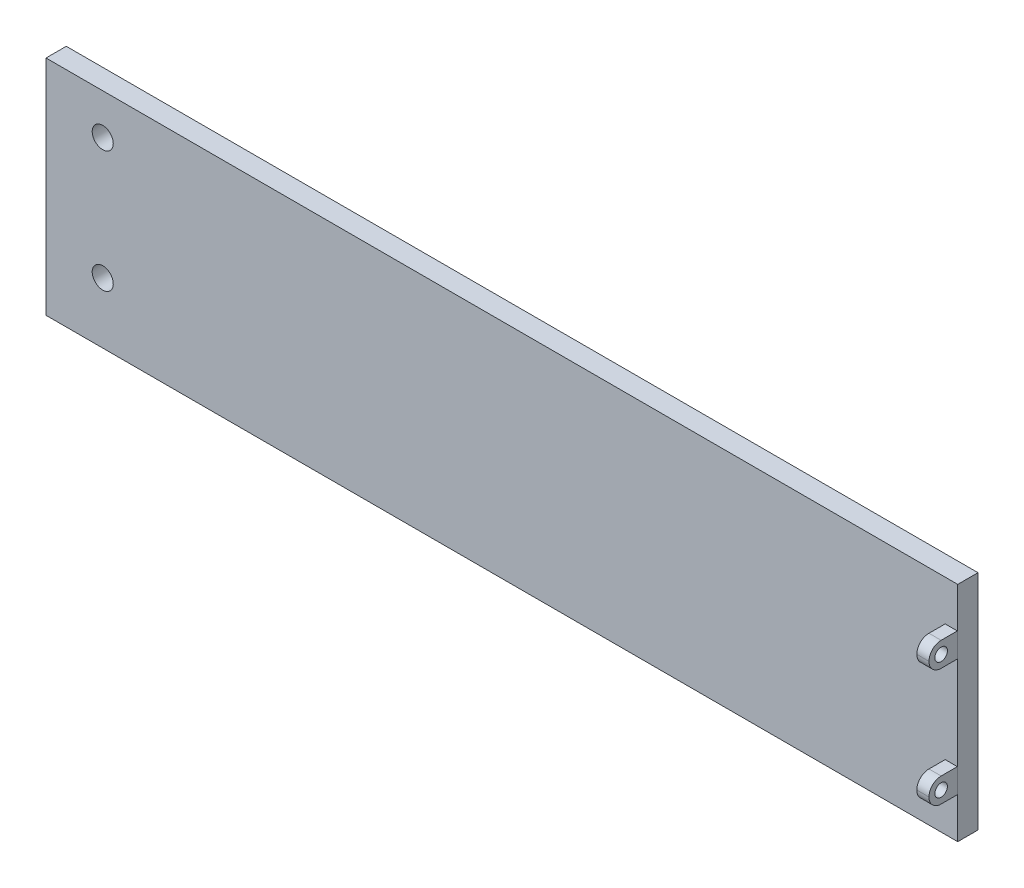
ISO-10303-21;
HEADER;
FILE_DESCRIPTION(('STEP AP214'),'2;1');
FILE_NAME('part.step','',(''),(''),'','','');
FILE_SCHEMA(('AUTOMOTIVE_DESIGN { 1 0 10303 214 1 1 1 1 }'));
ENDSEC;
DATA;
#1=APPLICATION_CONTEXT('core data for automotive mechanical design processes');
#2=APPLICATION_PROTOCOL_DEFINITION('international standard','automotive_design',2000,#1);
#3=PRODUCT_CONTEXT('',#1,'mechanical');
#4=PRODUCT('Part','Part','',(#3));
#5=PRODUCT_RELATED_PRODUCT_CATEGORY('part','',(#4));
#6=PRODUCT_DEFINITION_FORMATION('','',#4);
#7=PRODUCT_DEFINITION_CONTEXT('part definition',#1,'design');
#8=PRODUCT_DEFINITION('design','',#6,#7);
#9=PRODUCT_DEFINITION_SHAPE('','',#8);
#10=(LENGTH_UNIT() NAMED_UNIT(*) SI_UNIT(.MILLI.,.METRE.));
#11=(NAMED_UNIT(*) PLANE_ANGLE_UNIT() SI_UNIT($,.RADIAN.));
#12=(NAMED_UNIT(*) SI_UNIT($,.STERADIAN.) SOLID_ANGLE_UNIT());
#13=UNCERTAINTY_MEASURE_WITH_UNIT(LENGTH_MEASURE(1.E-05),#10,'distance_accuracy_value','');
#14=(GEOMETRIC_REPRESENTATION_CONTEXT(3) GLOBAL_UNCERTAINTY_ASSIGNED_CONTEXT((#13)) GLOBAL_UNIT_ASSIGNED_CONTEXT((#10,
#11,#12)) REPRESENTATION_CONTEXT('',''));
#15=CARTESIAN_POINT('',(0.,0.,0.));
#16=DIRECTION('',(0.,0.,1.));
#17=DIRECTION('',(1.,0.,0.));
#18=AXIS2_PLACEMENT_3D('',#15,#16,#17);
#19=CARTESIAN_POINT('',(225.,0.,0.));
#20=DIRECTION('',(-1.,0.,0.));
#21=DIRECTION('',(0.,0.,1.));
#22=AXIS2_PLACEMENT_3D('',#19,#20,#21);
#23=PLANE('',#22);
#24=DIRECTION('',(0.,0.,1.));
#25=VECTOR('',#24,1.);
#26=CARTESIAN_POINT('',(225.,0.,-4.99999999999999));
#27=LINE('',#26,#25);
#28=CARTESIAN_POINT('',(225.,0.,-4.99999999999999));
#29=VERTEX_POINT('',#28);
#30=CARTESIAN_POINT('',(225.,0.,0.));
#31=VERTEX_POINT('',#30);
#32=EDGE_CURVE('E262',#29,#31,#27,.T.);
#33=ORIENTED_EDGE('',*,*,#32,.F.);
#34=DIRECTION('',(0.,-1.,0.));
#35=VECTOR('',#34,1.);
#36=CARTESIAN_POINT('',(225.,55.,-4.99999999999998));
#37=LINE('',#36,#35);
#38=CARTESIAN_POINT('',(225.,55.,-4.99999999999998));
#39=VERTEX_POINT('',#38);
#40=EDGE_CURVE('E155',#39,#29,#37,.T.);
#41=ORIENTED_EDGE('',*,*,#40,.F.);
#42=DIRECTION('',(0.,0.,-1.));
#43=VECTOR('',#42,1.);
#44=CARTESIAN_POINT('',(225.,55.,0.));
#45=LINE('',#44,#43);
#46=CARTESIAN_POINT('',(225.,55.,0.));
#47=VERTEX_POINT('',#46);
#48=EDGE_CURVE('E152',#47,#39,#45,.T.);
#49=ORIENTED_EDGE('',*,*,#48,.F.);
#50=DIRECTION('',(0.,1.,0.));
#51=VECTOR('',#50,1.);
#52=CARTESIAN_POINT('',(225.,0.,0.));
#53=LINE('',#52,#51);
#54=EDGE_CURVE('E141',#31,#47,#53,.T.);
#55=ORIENTED_EDGE('',*,*,#54,.F.);
#56=EDGE_LOOP('',(#33,#41,#49,#55));
#57=FACE_BOUND('',#56,.T.);
#58=ADVANCED_FACE('F37',(#57),#23,.F.);
#59=CARTESIAN_POINT('',(708.,0.,0.));
#60=DIRECTION('',(0.,0.,-1.));
#61=DIRECTION('',(-1.,0.,0.));
#62=AXIS2_PLACEMENT_3D('',#59,#60,#61);
#63=PLANE('',#62);
#64=DIRECTION('',(0.,-1.,0.));
#65=VECTOR('',#64,1.);
#66=CARTESIAN_POINT('',(221.9,45.,0.));
#67=LINE('',#66,#65);
#68=CARTESIAN_POINT('',(221.9,45.,0.));
#69=VERTEX_POINT('',#68);
#70=CARTESIAN_POINT('',(221.9,39.,0.));
#71=VERTEX_POINT('',#70);
#72=EDGE_CURVE('E194',#69,#71,#67,.T.);
#73=ORIENTED_EDGE('',*,*,#72,.F.);
#74=DIRECTION('',(-1.,0.,0.));
#75=VECTOR('',#74,1.);
#76=CARTESIAN_POINT('',(221.9,45.,0.));
#77=LINE('',#76,#75);
#78=CARTESIAN_POINT('',(224.9,45.,0.));
#79=VERTEX_POINT('',#78);
#80=EDGE_CURVE('E202',#79,#69,#77,.T.);
#81=ORIENTED_EDGE('',*,*,#80,.F.);
#82=DIRECTION('',(0.,1.,0.));
#83=VECTOR('',#82,1.);
#84=CARTESIAN_POINT('',(224.9,45.,0.));
#85=LINE('',#84,#83);
#86=CARTESIAN_POINT('',(224.9,39.,0.));
#87=VERTEX_POINT('',#86);
#88=EDGE_CURVE('E199',#87,#79,#85,.T.);
#89=ORIENTED_EDGE('',*,*,#88,.F.);
#90=DIRECTION('',(1.,0.,0.));
#91=VECTOR('',#90,1.);
#92=CARTESIAN_POINT('',(221.9,39.,0.));
#93=LINE('',#92,#91);
#94=EDGE_CURVE('E196',#71,#87,#93,.T.);
#95=ORIENTED_EDGE('',*,*,#94,.F.);
#96=EDGE_LOOP('',(#73,#81,#89,#95));
#97=FACE_BOUND('',#96,.T.);
#98=CARTESIAN_POINT('',(14.,15.0000000000001,0.));
#99=DIRECTION('',(0.,0.,1.));
#100=DIRECTION('',(0.,1.,0.));
#101=AXIS2_PLACEMENT_3D('',#98,#99,#100);
#102=CIRCLE('',#101,2.60000000000007);
#103=CARTESIAN_POINT('',(14.,17.6000000000002,0.));
#104=VERTEX_POINT('',#103);
#105=EDGE_CURVE('E213',#104,#104,#102,.T.);
#106=ORIENTED_EDGE('',*,*,#105,.F.);
#107=EDGE_LOOP('',(#106));
#108=FACE_BOUND('',#107,.T.);
#109=CARTESIAN_POINT('',(14.,45.0000000000001,0.));
#110=DIRECTION('',(0.,0.,1.));
#111=DIRECTION('',(0.,1.,0.));
#112=AXIS2_PLACEMENT_3D('',#109,#110,#111);
#113=CIRCLE('',#112,2.60000000000007);
#114=CARTESIAN_POINT('',(14.,47.6000000000002,0.));
#115=VERTEX_POINT('',#114);
#116=EDGE_CURVE('E219',#115,#115,#113,.T.);
#117=ORIENTED_EDGE('',*,*,#116,.F.);
#118=EDGE_LOOP('',(#117));
#119=FACE_BOUND('',#118,.T.);
#120=DIRECTION('',(0.,-1.,0.));
#121=VECTOR('',#120,1.);
#122=CARTESIAN_POINT('',(221.9,16.,0.));
#123=LINE('',#122,#121);
#124=CARTESIAN_POINT('',(221.9,16.,0.));
#125=VERTEX_POINT('',#124);
#126=CARTESIAN_POINT('',(221.9,10.,0.));
#127=VERTEX_POINT('',#126);
#128=EDGE_CURVE('E192',#125,#127,#123,.T.);
#129=ORIENTED_EDGE('',*,*,#128,.F.);
#130=DIRECTION('',(-1.,0.,0.));
#131=VECTOR('',#130,1.);
#132=CARTESIAN_POINT('',(221.9,16.,0.));
#133=LINE('',#132,#131);
#134=CARTESIAN_POINT('',(224.9,16.,0.));
#135=VERTEX_POINT('',#134);
#136=EDGE_CURVE('E183',#135,#125,#133,.T.);
#137=ORIENTED_EDGE('',*,*,#136,.F.);
#138=DIRECTION('',(0.,1.,0.));
#139=VECTOR('',#138,1.);
#140=CARTESIAN_POINT('',(224.9,16.,0.));
#141=LINE('',#140,#139);
#142=CARTESIAN_POINT('',(224.9,10.,0.));
#143=VERTEX_POINT('',#142);
#144=EDGE_CURVE('E186',#143,#135,#141,.T.);
#145=ORIENTED_EDGE('',*,*,#144,.F.);
#146=DIRECTION('',(1.,0.,0.));
#147=VECTOR('',#146,1.);
#148=CARTESIAN_POINT('',(221.9,10.,0.));
#149=LINE('',#148,#147);
#150=EDGE_CURVE('E189',#127,#143,#149,.T.);
#151=ORIENTED_EDGE('',*,*,#150,.F.);
#152=EDGE_LOOP('',(#129,#137,#145,#151));
#153=FACE_BOUND('',#152,.T.);
#154=DIRECTION('',(-1.,0.,0.));
#155=VECTOR('',#154,1.);
#156=CARTESIAN_POINT('',(708.,0.,0.));
#157=LINE('',#156,#155);
#158=CARTESIAN_POINT('',(0.,0.,0.));
#159=VERTEX_POINT('',#158);
#160=EDGE_CURVE('E148',#31,#159,#157,.T.);
#161=ORIENTED_EDGE('',*,*,#160,.F.);
#162=ORIENTED_EDGE('',*,*,#54,.T.);
#163=DIRECTION('',(-1.,0.,0.));
#164=VECTOR('',#163,1.);
#165=CARTESIAN_POINT('',(708.,55.,0.));
#166=LINE('',#165,#164);
#167=CARTESIAN_POINT('',(0.,55.,0.));
#168=VERTEX_POINT('',#167);
#169=EDGE_CURVE('E146',#47,#168,#166,.T.);
#170=ORIENTED_EDGE('',*,*,#169,.T.);
#171=DIRECTION('',(0.,-1.,0.));
#172=VECTOR('',#171,1.);
#173=CARTESIAN_POINT('',(0.,0.,0.));
#174=LINE('',#173,#172);
#175=EDGE_CURVE('E165',#168,#159,#174,.T.);
#176=ORIENTED_EDGE('',*,*,#175,.T.);
#177=EDGE_LOOP('',(#161,#162,#170,#176));
#178=FACE_BOUND('',#177,.T.);
#179=ADVANCED_FACE('F143',(#97,#108,#119,#153,#178),#63,.F.);
#180=CARTESIAN_POINT('',(0.,55.,0.));
#181=DIRECTION('',(0.,-1.,0.));
#182=DIRECTION('',(0.,0.,-1.));
#183=AXIS2_PLACEMENT_3D('',#180,#181,#182);
#184=PLANE('',#183);
#185=ORIENTED_EDGE('',*,*,#169,.F.);
#186=ORIENTED_EDGE('',*,*,#48,.T.);
#187=DIRECTION('',(-1.,0.,0.));
#188=VECTOR('',#187,1.);
#189=CARTESIAN_POINT('',(708.,55.,-4.99999999999998));
#190=LINE('',#189,#188);
#191=CARTESIAN_POINT('',(0.,55.,-4.99999999999998));
#192=VERTEX_POINT('',#191);
#193=EDGE_CURVE('E41',#39,#192,#190,.T.);
#194=ORIENTED_EDGE('',*,*,#193,.T.);
#195=DIRECTION('',(0.,0.,1.));
#196=VECTOR('',#195,1.);
#197=CARTESIAN_POINT('',(0.,55.,0.));
#198=LINE('',#197,#196);
#199=EDGE_CURVE('E161',#192,#168,#198,.T.);
#200=ORIENTED_EDGE('',*,*,#199,.T.);
#201=EDGE_LOOP('',(#185,#186,#194,#200));
#202=FACE_BOUND('',#201,.T.);
#203=ADVANCED_FACE('F159',(#202),#184,.F.);
#204=CARTESIAN_POINT('',(708.,55.,-4.99999999999998));
#205=DIRECTION('',(0.,0.,1.));
#206=DIRECTION('',(0.,-1.,0.));
#207=AXIS2_PLACEMENT_3D('',#204,#205,#206);
#208=PLANE('',#207);
#209=CARTESIAN_POINT('',(14.,15.0000000000001,-4.99999999999999));
#210=DIRECTION('',(0.,0.,1.));
#211=DIRECTION('',(0.,1.,0.));
#212=AXIS2_PLACEMENT_3D('',#209,#210,#211);
#213=CIRCLE('',#212,2.60000000000007);
#214=CARTESIAN_POINT('',(14.,17.6000000000002,-4.99999999999999));
#215=VERTEX_POINT('',#214);
#216=EDGE_CURVE('E212',#215,#215,#213,.T.);
#217=ORIENTED_EDGE('',*,*,#216,.T.);
#218=EDGE_LOOP('',(#217));
#219=FACE_BOUND('',#218,.T.);
#220=CARTESIAN_POINT('',(14.,45.0000000000001,-4.99999999999998));
#221=DIRECTION('',(0.,0.,1.));
#222=DIRECTION('',(0.,1.,0.));
#223=AXIS2_PLACEMENT_3D('',#220,#221,#222);
#224=CIRCLE('',#223,2.60000000000007);
#225=CARTESIAN_POINT('',(14.,47.6000000000002,-4.99999999999998));
#226=VERTEX_POINT('',#225);
#227=EDGE_CURVE('E216',#226,#226,#224,.T.);
#228=ORIENTED_EDGE('',*,*,#227,.T.);
#229=EDGE_LOOP('',(#228));
#230=FACE_BOUND('',#229,.T.);
#231=ORIENTED_EDGE('',*,*,#193,.F.);
#232=ORIENTED_EDGE('',*,*,#40,.T.);
#233=DIRECTION('',(-1.,0.,0.));
#234=VECTOR('',#233,1.);
#235=CARTESIAN_POINT('',(708.,0.,-4.99999999999999));
#236=LINE('',#235,#234);
#237=CARTESIAN_POINT('',(0.,0.,-4.99999999999999));
#238=VERTEX_POINT('',#237);
#239=EDGE_CURVE('E163',#29,#238,#236,.T.);
#240=ORIENTED_EDGE('',*,*,#239,.T.);
#241=DIRECTION('',(0.,1.,0.));
#242=VECTOR('',#241,1.);
#243=CARTESIAN_POINT('',(0.,55.,-4.99999999999998));
#244=LINE('',#243,#242);
#245=EDGE_CURVE('E227',#238,#192,#244,.T.);
#246=ORIENTED_EDGE('',*,*,#245,.T.);
#247=EDGE_LOOP('',(#231,#232,#240,#246));
#248=FACE_BOUND('',#247,.T.);
#249=ADVANCED_FACE('F267',(#219,#230,#248),#208,.F.);
#250=CARTESIAN_POINT('',(708.,0.,-4.99999999999999));
#251=DIRECTION('',(0.,1.,0.));
#252=DIRECTION('',(0.,0.,1.));
#253=AXIS2_PLACEMENT_3D('',#250,#251,#252);
#254=PLANE('',#253);
#255=ORIENTED_EDGE('',*,*,#239,.F.);
#256=ORIENTED_EDGE('',*,*,#32,.T.);
#257=ORIENTED_EDGE('',*,*,#160,.T.);
#258=DIRECTION('',(0.,0.,-1.));
#259=VECTOR('',#258,1.);
#260=CARTESIAN_POINT('',(0.,0.,-4.99999999999999));
#261=LINE('',#260,#259);
#262=EDGE_CURVE('E222',#159,#238,#261,.T.);
#263=ORIENTED_EDGE('',*,*,#262,.T.);
#264=EDGE_LOOP('',(#255,#256,#257,#263));
#265=FACE_BOUND('',#264,.T.);
#266=ADVANCED_FACE('F39',(#265),#254,.F.);
#267=CARTESIAN_POINT('',(0.,0.,0.));
#268=DIRECTION('',(-1.,0.,0.));
#269=DIRECTION('',(0.,0.,1.));
#270=AXIS2_PLACEMENT_3D('',#267,#268,#269);
#271=PLANE('',#270);
#272=ORIENTED_EDGE('',*,*,#199,.F.);
#273=ORIENTED_EDGE('',*,*,#245,.F.);
#274=ORIENTED_EDGE('',*,*,#262,.F.);
#275=ORIENTED_EDGE('',*,*,#175,.F.);
#276=EDGE_LOOP('',(#272,#273,#274,#275));
#277=FACE_BOUND('',#276,.T.);
#278=ADVANCED_FACE('F273',(#277),#271,.T.);
#279=CARTESIAN_POINT('',(14.,45.0000000000001,0.));
#280=DIRECTION('',(0.,0.,-1.));
#281=DIRECTION('',(0.,1.,0.));
#282=AXIS2_PLACEMENT_3D('',#279,#280,#281);
#283=CYLINDRICAL_SURFACE('',#282,2.60000000000007);
#284=ORIENTED_EDGE('',*,*,#116,.T.);
#285=EDGE_LOOP('',(#284));
#286=FACE_BOUND('',#285,.T.);
#287=ORIENTED_EDGE('',*,*,#227,.F.);
#288=EDGE_LOOP('',(#287));
#289=FACE_BOUND('',#288,.T.);
#290=ADVANCED_FACE('F275',(#286,#289),#283,.F.);
#291=CARTESIAN_POINT('',(14.,15.0000000000001,0.));
#292=DIRECTION('',(0.,0.,-1.));
#293=DIRECTION('',(0.,1.,0.));
#294=AXIS2_PLACEMENT_3D('',#291,#292,#293);
#295=CYLINDRICAL_SURFACE('',#294,2.60000000000007);
#296=ORIENTED_EDGE('',*,*,#105,.T.);
#297=EDGE_LOOP('',(#296));
#298=FACE_BOUND('',#297,.T.);
#299=ORIENTED_EDGE('',*,*,#216,.F.);
#300=EDGE_LOOP('',(#299));
#301=FACE_BOUND('',#300,.T.);
#302=ADVANCED_FACE('F282',(#298,#301),#295,.F.);
#303=CARTESIAN_POINT('',(221.9,45.,7.));
#304=DIRECTION('',(1.,0.,0.));
#305=DIRECTION('',(0.,0.,-1.));
#306=AXIS2_PLACEMENT_3D('',#303,#304,#305);
#307=PLANE('',#306);
#308=CARTESIAN_POINT('',(221.9,42.,4.));
#309=DIRECTION('',(-1.,0.,0.));
#310=DIRECTION('',(0.,0.,1.));
#311=AXIS2_PLACEMENT_3D('',#308,#309,#310);
#312=CIRCLE('',#311,1.55);
#313=CARTESIAN_POINT('',(221.9,42.,5.55));
#314=VERTEX_POINT('',#313);
#315=EDGE_CURVE('E168',#314,#314,#312,.T.);
#316=ORIENTED_EDGE('',*,*,#315,.F.);
#317=EDGE_LOOP('',(#316));
#318=FACE_BOUND('',#317,.T.);
#319=DIRECTION('',(0.,0.,-1.));
#320=VECTOR('',#319,1.);
#321=CARTESIAN_POINT('',(221.9,39.,7.));
#322=LINE('',#321,#320);
#323=CARTESIAN_POINT('',(221.9,39.,4.));
#324=VERTEX_POINT('',#323);
#325=EDGE_CURVE('E210',#324,#71,#322,.T.);
#326=ORIENTED_EDGE('',*,*,#325,.F.);
#327=CARTESIAN_POINT('',(221.9,42.,4.));
#328=DIRECTION('',(1.,0.,0.));
#329=DIRECTION('',(0.,0.,-1.));
#330=AXIS2_PLACEMENT_3D('',#327,#328,#329);
#331=CIRCLE('',#330,3.);
#332=CARTESIAN_POINT('',(221.9,42.,7.));
#333=VERTEX_POINT('',#332);
#334=EDGE_CURVE('E258',#324,#333,#331,.F.);
#335=ORIENTED_EDGE('',*,*,#334,.T.);
#336=CARTESIAN_POINT('',(221.9,42.,4.));
#337=DIRECTION('',(1.,0.,0.));
#338=DIRECTION('',(0.,0.,-1.));
#339=AXIS2_PLACEMENT_3D('',#336,#337,#338);
#340=CIRCLE('',#339,3.);
#341=CARTESIAN_POINT('',(221.9,45.,4.));
#342=VERTEX_POINT('',#341);
#343=EDGE_CURVE('E256',#333,#342,#340,.F.);
#344=ORIENTED_EDGE('',*,*,#343,.T.);
#345=DIRECTION('',(0.,0.,-1.));
#346=VECTOR('',#345,1.);
#347=CARTESIAN_POINT('',(221.9,45.,7.));
#348=LINE('',#347,#346);
#349=EDGE_CURVE('E62',#342,#69,#348,.T.);
#350=ORIENTED_EDGE('',*,*,#349,.T.);
#351=ORIENTED_EDGE('',*,*,#72,.T.);
#352=EDGE_LOOP('',(#326,#335,#344,#350,#351));
#353=FACE_BOUND('',#352,.T.);
#354=ADVANCED_FACE('F367',(#318,#353),#307,.F.);
#355=CARTESIAN_POINT('',(221.9,39.,7.));
#356=DIRECTION('',(0.,1.,0.));
#357=DIRECTION('',(0.,0.,1.));
#358=AXIS2_PLACEMENT_3D('',#355,#356,#357);
#359=PLANE('',#358);
#360=DIRECTION('',(0.,0.,-1.));
#361=VECTOR('',#360,1.);
#362=CARTESIAN_POINT('',(224.9,39.,7.));
#363=LINE('',#362,#361);
#364=CARTESIAN_POINT('',(224.9,39.,4.));
#365=VERTEX_POINT('',#364);
#366=EDGE_CURVE('E208',#365,#87,#363,.T.);
#367=ORIENTED_EDGE('',*,*,#366,.F.);
#368=DIRECTION('',(1.,0.,0.));
#369=VECTOR('',#368,1.);
#370=CARTESIAN_POINT('',(221.9,39.,4.));
#371=LINE('',#370,#369);
#372=EDGE_CURVE('E253',#365,#324,#371,.F.);
#373=ORIENTED_EDGE('',*,*,#372,.T.);
#374=ORIENTED_EDGE('',*,*,#325,.T.);
#375=ORIENTED_EDGE('',*,*,#94,.T.);
#376=EDGE_LOOP('',(#367,#373,#374,#375));
#377=FACE_BOUND('',#376,.T.);
#378=ADVANCED_FACE('F373',(#377),#359,.F.);
#379=CARTESIAN_POINT('',(224.9,45.,7.));
#380=DIRECTION('',(-1.,0.,0.));
#381=DIRECTION('',(0.,0.,1.));
#382=AXIS2_PLACEMENT_3D('',#379,#380,#381);
#383=PLANE('',#382);
#384=CARTESIAN_POINT('',(224.9,42.,4.));
#385=DIRECTION('',(-1.,0.,0.));
#386=DIRECTION('',(0.,0.,1.));
#387=AXIS2_PLACEMENT_3D('',#384,#385,#386);
#388=CIRCLE('',#387,1.55);
#389=CARTESIAN_POINT('',(224.9,42.,5.55));
#390=VERTEX_POINT('',#389);
#391=EDGE_CURVE('E177',#390,#390,#388,.T.);
#392=ORIENTED_EDGE('',*,*,#391,.T.);
#393=EDGE_LOOP('',(#392));
#394=FACE_BOUND('',#393,.T.);
#395=CARTESIAN_POINT('',(224.9,42.,4.));
#396=DIRECTION('',(-1.,0.,0.));
#397=DIRECTION('',(0.,0.,1.));
#398=AXIS2_PLACEMENT_3D('',#395,#396,#397);
#399=CIRCLE('',#398,3.);
#400=CARTESIAN_POINT('',(224.9,45.,4.));
#401=VERTEX_POINT('',#400);
#402=CARTESIAN_POINT('',(224.9,42.,7.));
#403=VERTEX_POINT('',#402);
#404=EDGE_CURVE('E249',#401,#403,#399,.F.);
#405=ORIENTED_EDGE('',*,*,#404,.T.);
#406=CARTESIAN_POINT('',(224.9,42.,4.));
#407=DIRECTION('',(-1.,0.,0.));
#408=DIRECTION('',(0.,0.,1.));
#409=AXIS2_PLACEMENT_3D('',#406,#407,#408);
#410=CIRCLE('',#409,3.);
#411=EDGE_CURVE('E251',#403,#365,#410,.F.);
#412=ORIENTED_EDGE('',*,*,#411,.T.);
#413=ORIENTED_EDGE('',*,*,#366,.T.);
#414=ORIENTED_EDGE('',*,*,#88,.T.);
#415=DIRECTION('',(0.,0.,-1.));
#416=VECTOR('',#415,1.);
#417=CARTESIAN_POINT('',(224.9,45.,7.));
#418=LINE('',#417,#416);
#419=EDGE_CURVE('E206',#401,#79,#418,.T.);
#420=ORIENTED_EDGE('',*,*,#419,.F.);
#421=EDGE_LOOP('',(#405,#412,#413,#414,#420));
#422=FACE_BOUND('',#421,.T.);
#423=ADVANCED_FACE('F379',(#394,#422),#383,.F.);
#424=CARTESIAN_POINT('',(221.9,45.,7.));
#425=DIRECTION('',(0.,-1.,0.));
#426=DIRECTION('',(0.,0.,-1.));
#427=AXIS2_PLACEMENT_3D('',#424,#425,#426);
#428=PLANE('',#427);
#429=ORIENTED_EDGE('',*,*,#349,.F.);
#430=DIRECTION('',(-1.,0.,0.));
#431=VECTOR('',#430,1.);
#432=CARTESIAN_POINT('',(224.9,45.,4.));
#433=LINE('',#432,#431);
#434=EDGE_CURVE('E260',#342,#401,#433,.F.);
#435=ORIENTED_EDGE('',*,*,#434,.T.);
#436=ORIENTED_EDGE('',*,*,#419,.T.);
#437=ORIENTED_EDGE('',*,*,#80,.T.);
#438=EDGE_LOOP('',(#429,#435,#436,#437));
#439=FACE_BOUND('',#438,.T.);
#440=ADVANCED_FACE('F349',(#439),#428,.F.);
#441=CARTESIAN_POINT('',(221.9,16.,7.));
#442=DIRECTION('',(1.,0.,0.));
#443=DIRECTION('',(0.,0.,-1.));
#444=AXIS2_PLACEMENT_3D('',#441,#442,#443);
#445=PLANE('',#444);
#446=CARTESIAN_POINT('',(221.9,13.,4.));
#447=DIRECTION('',(-1.,0.,0.));
#448=DIRECTION('',(0.,0.,1.));
#449=AXIS2_PLACEMENT_3D('',#446,#447,#448);
#450=CIRCLE('',#449,1.55);
#451=CARTESIAN_POINT('',(221.9,13.,5.55));
#452=VERTEX_POINT('',#451);
#453=EDGE_CURVE('E171',#452,#452,#450,.T.);
#454=ORIENTED_EDGE('',*,*,#453,.F.);
#455=EDGE_LOOP('',(#454));
#456=FACE_BOUND('',#455,.T.);
#457=DIRECTION('',(0.,0.,-1.));
#458=VECTOR('',#457,1.);
#459=CARTESIAN_POINT('',(221.9,10.,7.));
#460=LINE('',#459,#458);
#461=CARTESIAN_POINT('',(221.9,10.,4.));
#462=VERTEX_POINT('',#461);
#463=EDGE_CURVE('E175',#462,#127,#460,.T.);
#464=ORIENTED_EDGE('',*,*,#463,.F.);
#465=CARTESIAN_POINT('',(221.9,13.,4.));
#466=DIRECTION('',(1.,0.,0.));
#467=DIRECTION('',(0.,0.,-1.));
#468=AXIS2_PLACEMENT_3D('',#465,#466,#467);
#469=CIRCLE('',#468,3.);
#470=CARTESIAN_POINT('',(221.9,13.,7.));
#471=VERTEX_POINT('',#470);
#472=EDGE_CURVE('E245',#462,#471,#469,.F.);
#473=ORIENTED_EDGE('',*,*,#472,.T.);
#474=CARTESIAN_POINT('',(221.9,13.,4.));
#475=DIRECTION('',(1.,0.,0.));
#476=DIRECTION('',(0.,0.,-1.));
#477=AXIS2_PLACEMENT_3D('',#474,#475,#476);
#478=CIRCLE('',#477,3.);
#479=CARTESIAN_POINT('',(221.9,16.,4.));
#480=VERTEX_POINT('',#479);
#481=EDGE_CURVE('E243',#471,#480,#478,.F.);
#482=ORIENTED_EDGE('',*,*,#481,.T.);
#483=DIRECTION('',(0.,0.,-1.));
#484=VECTOR('',#483,1.);
#485=CARTESIAN_POINT('',(221.9,16.,7.));
#486=LINE('',#485,#484);
#487=EDGE_CURVE('E54',#480,#125,#486,.T.);
#488=ORIENTED_EDGE('',*,*,#487,.T.);
#489=ORIENTED_EDGE('',*,*,#128,.T.);
#490=EDGE_LOOP('',(#464,#473,#482,#488,#489));
#491=FACE_BOUND('',#490,.T.);
#492=ADVANCED_FACE('F324',(#456,#491),#445,.F.);
#493=CARTESIAN_POINT('',(221.9,10.,7.));
#494=DIRECTION('',(0.,1.,0.));
#495=DIRECTION('',(0.,0.,1.));
#496=AXIS2_PLACEMENT_3D('',#493,#494,#495);
#497=PLANE('',#496);
#498=DIRECTION('',(0.,0.,-1.));
#499=VECTOR('',#498,1.);
#500=CARTESIAN_POINT('',(224.9,10.,7.));
#501=LINE('',#500,#499);
#502=CARTESIAN_POINT('',(224.9,10.,4.));
#503=VERTEX_POINT('',#502);
#504=EDGE_CURVE('E178',#503,#143,#501,.T.);
#505=ORIENTED_EDGE('',*,*,#504,.F.);
#506=DIRECTION('',(1.,0.,0.));
#507=VECTOR('',#506,1.);
#508=CARTESIAN_POINT('',(221.9,10.,4.));
#509=LINE('',#508,#507);
#510=EDGE_CURVE('E240',#503,#462,#509,.F.);
#511=ORIENTED_EDGE('',*,*,#510,.T.);
#512=ORIENTED_EDGE('',*,*,#463,.T.);
#513=ORIENTED_EDGE('',*,*,#150,.T.);
#514=EDGE_LOOP('',(#505,#511,#512,#513));
#515=FACE_BOUND('',#514,.T.);
#516=ADVANCED_FACE('F322',(#515),#497,.F.);
#517=CARTESIAN_POINT('',(224.9,16.,7.));
#518=DIRECTION('',(-1.,0.,0.));
#519=DIRECTION('',(0.,0.,1.));
#520=AXIS2_PLACEMENT_3D('',#517,#518,#519);
#521=PLANE('',#520);
#522=CARTESIAN_POINT('',(224.9,13.,4.));
#523=DIRECTION('',(-1.,0.,0.));
#524=DIRECTION('',(0.,0.,1.));
#525=AXIS2_PLACEMENT_3D('',#522,#523,#524);
#526=CIRCLE('',#525,1.55);
#527=CARTESIAN_POINT('',(224.9,13.,5.55));
#528=VERTEX_POINT('',#527);
#529=EDGE_CURVE('E172',#528,#528,#526,.T.);
#530=ORIENTED_EDGE('',*,*,#529,.T.);
#531=EDGE_LOOP('',(#530));
#532=FACE_BOUND('',#531,.T.);
#533=CARTESIAN_POINT('',(224.9,13.,4.));
#534=DIRECTION('',(-1.,0.,0.));
#535=DIRECTION('',(0.,0.,1.));
#536=AXIS2_PLACEMENT_3D('',#533,#534,#535);
#537=CIRCLE('',#536,3.);
#538=CARTESIAN_POINT('',(224.9,16.,4.));
#539=VERTEX_POINT('',#538);
#540=CARTESIAN_POINT('',(224.9,13.,7.));
#541=VERTEX_POINT('',#540);
#542=EDGE_CURVE('E236',#539,#541,#537,.F.);
#543=ORIENTED_EDGE('',*,*,#542,.T.);
#544=CARTESIAN_POINT('',(224.9,13.,4.));
#545=DIRECTION('',(-1.,0.,0.));
#546=DIRECTION('',(0.,0.,1.));
#547=AXIS2_PLACEMENT_3D('',#544,#545,#546);
#548=CIRCLE('',#547,3.);
#549=EDGE_CURVE('E238',#541,#503,#548,.F.);
#550=ORIENTED_EDGE('',*,*,#549,.T.);
#551=ORIENTED_EDGE('',*,*,#504,.T.);
#552=ORIENTED_EDGE('',*,*,#144,.T.);
#553=DIRECTION('',(0.,0.,-1.));
#554=VECTOR('',#553,1.);
#555=CARTESIAN_POINT('',(224.9,16.,7.));
#556=LINE('',#555,#554);
#557=EDGE_CURVE('E180',#539,#135,#556,.T.);
#558=ORIENTED_EDGE('',*,*,#557,.F.);
#559=EDGE_LOOP('',(#543,#550,#551,#552,#558));
#560=FACE_BOUND('',#559,.T.);
#561=ADVANCED_FACE('F334',(#532,#560),#521,.F.);
#562=CARTESIAN_POINT('',(221.9,16.,7.));
#563=DIRECTION('',(0.,-1.,0.));
#564=DIRECTION('',(0.,0.,-1.));
#565=AXIS2_PLACEMENT_3D('',#562,#563,#564);
#566=PLANE('',#565);
#567=ORIENTED_EDGE('',*,*,#487,.F.);
#568=DIRECTION('',(-1.,0.,0.));
#569=VECTOR('',#568,1.);
#570=CARTESIAN_POINT('',(224.9,16.,4.));
#571=LINE('',#570,#569);
#572=EDGE_CURVE('E247',#480,#539,#571,.F.);
#573=ORIENTED_EDGE('',*,*,#572,.T.);
#574=ORIENTED_EDGE('',*,*,#557,.T.);
#575=ORIENTED_EDGE('',*,*,#136,.T.);
#576=EDGE_LOOP('',(#567,#573,#574,#575));
#577=FACE_BOUND('',#576,.T.);
#578=ADVANCED_FACE('F329',(#577),#566,.F.);
#579=CARTESIAN_POINT('',(228.9,13.,4.));
#580=DIRECTION('',(-1.,0.,0.));
#581=DIRECTION('',(0.,0.,1.));
#582=AXIS2_PLACEMENT_3D('',#579,#580,#581);
#583=CYLINDRICAL_SURFACE('',#582,1.55);
#584=ORIENTED_EDGE('',*,*,#453,.T.);
#585=EDGE_LOOP('',(#584));
#586=FACE_BOUND('',#585,.T.);
#587=ORIENTED_EDGE('',*,*,#529,.F.);
#588=EDGE_LOOP('',(#587));
#589=FACE_BOUND('',#588,.T.);
#590=ADVANCED_FACE('F342',(#586,#589),#583,.F.);
#591=CARTESIAN_POINT('',(228.9,42.,4.));
#592=DIRECTION('',(-1.,0.,0.));
#593=DIRECTION('',(0.,0.,1.));
#594=AXIS2_PLACEMENT_3D('',#591,#592,#593);
#595=CYLINDRICAL_SURFACE('',#594,1.55);
#596=ORIENTED_EDGE('',*,*,#315,.T.);
#597=EDGE_LOOP('',(#596));
#598=FACE_BOUND('',#597,.T.);
#599=ORIENTED_EDGE('',*,*,#391,.F.);
#600=EDGE_LOOP('',(#599));
#601=FACE_BOUND('',#600,.T.);
#602=ADVANCED_FACE('F309',(#598,#601),#595,.F.);
#603=CARTESIAN_POINT('',(0.,13.,4.));
#604=DIRECTION('',(1.,0.,0.));
#605=DIRECTION('',(0.,0.,-1.));
#606=AXIS2_PLACEMENT_3D('',#603,#604,#605);
#607=CYLINDRICAL_SURFACE('',#606,3.);
#608=ORIENTED_EDGE('',*,*,#572,.F.);
#609=ORIENTED_EDGE('',*,*,#481,.F.);
#610=DIRECTION('',(-1.,0.,0.));
#611=VECTOR('',#610,1.);
#612=CARTESIAN_POINT('',(221.9,13.,7.));
#613=LINE('',#612,#611);
#614=EDGE_CURVE('E46',#541,#471,#613,.T.);
#615=ORIENTED_EDGE('',*,*,#614,.F.);
#616=ORIENTED_EDGE('',*,*,#542,.F.);
#617=EDGE_LOOP('',(#608,#609,#615,#616));
#618=FACE_BOUND('',#617,.T.);
#619=ADVANCED_FACE('F307',(#618),#607,.T.);
#620=CARTESIAN_POINT('',(0.,13.,4.));
#621=DIRECTION('',(-1.,0.,0.));
#622=DIRECTION('',(0.,0.,1.));
#623=AXIS2_PLACEMENT_3D('',#620,#621,#622);
#624=CYLINDRICAL_SURFACE('',#623,3.);
#625=ORIENTED_EDGE('',*,*,#472,.F.);
#626=ORIENTED_EDGE('',*,*,#510,.F.);
#627=ORIENTED_EDGE('',*,*,#549,.F.);
#628=ORIENTED_EDGE('',*,*,#614,.T.);
#629=EDGE_LOOP('',(#625,#626,#627,#628));
#630=FACE_BOUND('',#629,.T.);
#631=ADVANCED_FACE('F304',(#630),#624,.T.);
#632=CARTESIAN_POINT('',(0.,42.,4.));
#633=DIRECTION('',(1.,0.,0.));
#634=DIRECTION('',(0.,0.,-1.));
#635=AXIS2_PLACEMENT_3D('',#632,#633,#634);
#636=CYLINDRICAL_SURFACE('',#635,3.);
#637=ORIENTED_EDGE('',*,*,#434,.F.);
#638=ORIENTED_EDGE('',*,*,#343,.F.);
#639=DIRECTION('',(-1.,0.,0.));
#640=VECTOR('',#639,1.);
#641=CARTESIAN_POINT('',(221.9,42.,7.));
#642=LINE('',#641,#640);
#643=EDGE_CURVE('E11',#403,#333,#642,.T.);
#644=ORIENTED_EDGE('',*,*,#643,.F.);
#645=ORIENTED_EDGE('',*,*,#404,.F.);
#646=EDGE_LOOP('',(#637,#638,#644,#645));
#647=FACE_BOUND('',#646,.T.);
#648=ADVANCED_FACE('F298',(#647),#636,.T.);
#649=CARTESIAN_POINT('',(0.,42.,4.));
#650=DIRECTION('',(-1.,0.,0.));
#651=DIRECTION('',(0.,0.,1.));
#652=AXIS2_PLACEMENT_3D('',#649,#650,#651);
#653=CYLINDRICAL_SURFACE('',#652,3.);
#654=ORIENTED_EDGE('',*,*,#334,.F.);
#655=ORIENTED_EDGE('',*,*,#372,.F.);
#656=ORIENTED_EDGE('',*,*,#411,.F.);
#657=ORIENTED_EDGE('',*,*,#643,.T.);
#658=EDGE_LOOP('',(#654,#655,#656,#657));
#659=FACE_BOUND('',#658,.T.);
#660=ADVANCED_FACE('F288',(#659),#653,.T.);
#661=CLOSED_SHELL('',(#58,#179,#203,#249,#266,#278,#290,#302,#354,#378,#423,#440,#492,#516,#561,
#578,#590,#602,#619,#631,#648,#660));
#662=MANIFOLD_SOLID_BREP('B2',#661);
#663=ADVANCED_BREP_SHAPE_REPRESENTATION('',(#18,#662),#14);
#664=SHAPE_DEFINITION_REPRESENTATION(#9,#663);
ENDSEC;
END-ISO-10303-21;
